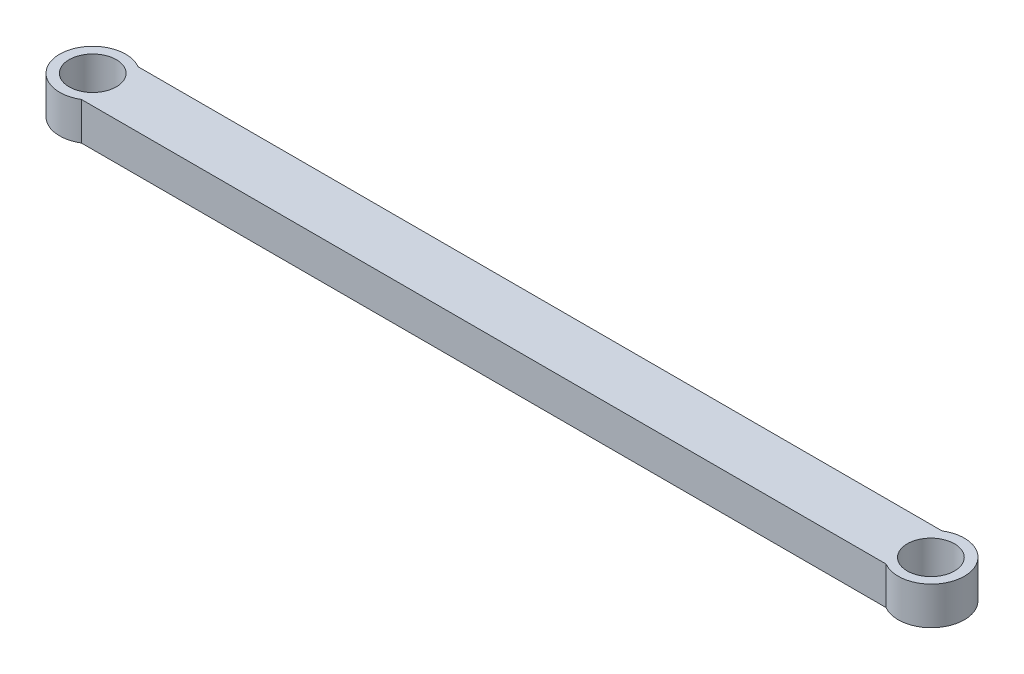
ISO-10303-21;
HEADER;
FILE_DESCRIPTION(('STEP AP214'),'2;1');
FILE_NAME('part.step','',(''),(''),'','','');
FILE_SCHEMA(('AUTOMOTIVE_DESIGN { 1 0 10303 214 1 1 1 1 }'));
ENDSEC;
DATA;
#1=APPLICATION_CONTEXT('core data for automotive mechanical design processes');
#2=APPLICATION_PROTOCOL_DEFINITION('international standard','automotive_design',2000,#1);
#3=PRODUCT_CONTEXT('',#1,'mechanical');
#4=PRODUCT('Part','Part','',(#3));
#5=PRODUCT_RELATED_PRODUCT_CATEGORY('part','',(#4));
#6=PRODUCT_DEFINITION_FORMATION('','',#4);
#7=PRODUCT_DEFINITION_CONTEXT('part definition',#1,'design');
#8=PRODUCT_DEFINITION('design','',#6,#7);
#9=PRODUCT_DEFINITION_SHAPE('','',#8);
#10=(LENGTH_UNIT() NAMED_UNIT(*) SI_UNIT(.MILLI.,.METRE.));
#11=(NAMED_UNIT(*) PLANE_ANGLE_UNIT() SI_UNIT($,.RADIAN.));
#12=(NAMED_UNIT(*) SI_UNIT($,.STERADIAN.) SOLID_ANGLE_UNIT());
#13=UNCERTAINTY_MEASURE_WITH_UNIT(LENGTH_MEASURE(1.E-05),#10,'distance_accuracy_value','');
#14=(GEOMETRIC_REPRESENTATION_CONTEXT(3) GLOBAL_UNCERTAINTY_ASSIGNED_CONTEXT((#13)) GLOBAL_UNIT_ASSIGNED_CONTEXT((#10,
#11,#12)) REPRESENTATION_CONTEXT('',''));
#15=CARTESIAN_POINT('',(0.,0.,0.));
#16=DIRECTION('',(0.,0.,1.));
#17=DIRECTION('',(1.,0.,0.));
#18=AXIS2_PLACEMENT_3D('',#15,#16,#17);
#19=CARTESIAN_POINT('',(0.,2.,1.5));
#20=DIRECTION('',(0.,0.,-1.));
#21=DIRECTION('',(-1.,0.,0.));
#22=AXIS2_PLACEMENT_3D('',#19,#20,#21);
#23=PLANE('',#22);
#24=DIRECTION('',(1.,0.,0.));
#25=VECTOR('',#24,1.);
#26=CARTESIAN_POINT('',(0.,0.,1.5));
#27=LINE('',#26,#25);
#28=CARTESIAN_POINT('',(0.901387818865998,0.,1.5));
#29=VERTEX_POINT('',#28);
#30=CARTESIAN_POINT('',(43.4998455410051,0.,1.5));
#31=VERTEX_POINT('',#30);
#32=EDGE_CURVE('E111',#29,#31,#27,.T.);
#33=ORIENTED_EDGE('',*,*,#32,.T.);
#34=DIRECTION('',(0.,-1.,0.));
#35=VECTOR('',#34,1.);
#36=CARTESIAN_POINT('',(43.4998455410051,2.,1.5));
#37=LINE('',#36,#35);
#38=CARTESIAN_POINT('',(43.4998455410051,2.,1.5));
#39=VERTEX_POINT('',#38);
#40=EDGE_CURVE('E11',#39,#31,#37,.T.);
#41=ORIENTED_EDGE('',*,*,#40,.F.);
#42=DIRECTION('',(1.,0.,0.));
#43=VECTOR('',#42,1.);
#44=CARTESIAN_POINT('',(0.,2.,1.5));
#45=LINE('',#44,#43);
#46=CARTESIAN_POINT('',(0.901387818865998,2.,1.5));
#47=VERTEX_POINT('',#46);
#48=EDGE_CURVE('E90',#47,#39,#45,.T.);
#49=ORIENTED_EDGE('',*,*,#48,.F.);
#50=DIRECTION('',(0.,-1.,0.));
#51=VECTOR('',#50,1.);
#52=CARTESIAN_POINT('',(0.901387818865998,2.,1.5));
#53=LINE('',#52,#51);
#54=EDGE_CURVE('E110',#47,#29,#53,.T.);
#55=ORIENTED_EDGE('',*,*,#54,.T.);
#56=EDGE_LOOP('',(#33,#41,#49,#55));
#57=FACE_BOUND('',#56,.T.);
#58=ADVANCED_FACE('F42',(#57),#23,.F.);
#59=CARTESIAN_POINT('',(44.3835054520691,2.,-0.0105115562545324));
#60=DIRECTION('',(0.,-1.,0.));
#61=DIRECTION('',(0.,0.,-1.));
#62=AXIS2_PLACEMENT_3D('',#59,#60,#61);
#63=CYLINDRICAL_SURFACE('',#62,1.75);
#64=CARTESIAN_POINT('',(44.3835054520691,0.,-0.0105115562545324));
#65=DIRECTION('',(0.,1.,0.));
#66=DIRECTION('',(0.,0.,1.));
#67=AXIS2_PLACEMENT_3D('',#64,#65,#66);
#68=CIRCLE('',#67,1.75);
#69=CARTESIAN_POINT('',(43.46485199404,0.,-1.5));
#70=VERTEX_POINT('',#69);
#71=EDGE_CURVE('E95',#31,#70,#68,.T.);
#72=ORIENTED_EDGE('',*,*,#71,.T.);
#73=DIRECTION('',(0.,-1.,0.));
#74=VECTOR('',#73,1.);
#75=CARTESIAN_POINT('',(43.46485199404,2.,-1.5));
#76=LINE('',#75,#74);
#77=CARTESIAN_POINT('',(43.46485199404,2.,-1.5));
#78=VERTEX_POINT('',#77);
#79=EDGE_CURVE('E50',#78,#70,#76,.T.);
#80=ORIENTED_EDGE('',*,*,#79,.F.);
#81=CARTESIAN_POINT('',(44.3835054520691,2.,-0.0105115562545324));
#82=DIRECTION('',(0.,1.,0.));
#83=DIRECTION('',(0.,0.,1.));
#84=AXIS2_PLACEMENT_3D('',#81,#82,#83);
#85=CIRCLE('',#84,1.75);
#86=EDGE_CURVE('E84',#39,#78,#85,.T.);
#87=ORIENTED_EDGE('',*,*,#86,.F.);
#88=ORIENTED_EDGE('',*,*,#40,.T.);
#89=EDGE_LOOP('',(#72,#80,#87,#88));
#90=FACE_BOUND('',#89,.T.);
#91=ADVANCED_FACE('F94',(#90),#63,.T.);
#92=CARTESIAN_POINT('',(0.,2.,-1.5));
#93=DIRECTION('',(0.,0.,-1.));
#94=DIRECTION('',(-1.,0.,0.));
#95=AXIS2_PLACEMENT_3D('',#92,#93,#94);
#96=PLANE('',#95);
#97=DIRECTION('',(1.,0.,0.));
#98=VECTOR('',#97,1.);
#99=CARTESIAN_POINT('',(0.,0.,-1.5));
#100=LINE('',#99,#98);
#101=CARTESIAN_POINT('',(0.901387818865998,0.,-1.5));
#102=VERTEX_POINT('',#101);
#103=EDGE_CURVE('E115',#102,#70,#100,.T.);
#104=ORIENTED_EDGE('',*,*,#103,.F.);
#105=DIRECTION('',(0.,-1.,0.));
#106=VECTOR('',#105,1.);
#107=CARTESIAN_POINT('',(0.901387818865998,2.,-1.5));
#108=LINE('',#107,#106);
#109=CARTESIAN_POINT('',(0.901387818865998,2.,-1.5));
#110=VERTEX_POINT('',#109);
#111=EDGE_CURVE('E74',#110,#102,#108,.T.);
#112=ORIENTED_EDGE('',*,*,#111,.F.);
#113=DIRECTION('',(1.,0.,0.));
#114=VECTOR('',#113,1.);
#115=CARTESIAN_POINT('',(0.,2.,-1.5));
#116=LINE('',#115,#114);
#117=EDGE_CURVE('E88',#110,#78,#116,.T.);
#118=ORIENTED_EDGE('',*,*,#117,.T.);
#119=ORIENTED_EDGE('',*,*,#79,.T.);
#120=EDGE_LOOP('',(#104,#112,#118,#119));
#121=FACE_BOUND('',#120,.T.);
#122=ADVANCED_FACE('F99',(#121),#96,.T.);
#123=CARTESIAN_POINT('',(44.3835054520691,2.,0.0105115562545301));
#124=DIRECTION('',(0.,-1.,0.));
#125=DIRECTION('',(0.,0.,-1.));
#126=AXIS2_PLACEMENT_3D('',#123,#124,#125);
#127=CYLINDRICAL_SURFACE('',#126,1.25);
#128=CARTESIAN_POINT('',(44.3835054520691,2.,0.0105115562545301));
#129=DIRECTION('',(0.,1.,0.));
#130=DIRECTION('',(0.,0.,1.));
#131=AXIS2_PLACEMENT_3D('',#128,#129,#130);
#132=CIRCLE('',#131,1.25);
#133=CARTESIAN_POINT('',(44.3835054520691,2.,1.26051155625453));
#134=VERTEX_POINT('',#133);
#135=EDGE_CURVE('E101',#134,#134,#132,.T.);
#136=ORIENTED_EDGE('',*,*,#135,.T.);
#137=EDGE_LOOP('',(#136));
#138=FACE_BOUND('',#137,.T.);
#139=CARTESIAN_POINT('',(44.3835054520691,0.,0.0105115562545301));
#140=DIRECTION('',(0.,1.,0.));
#141=DIRECTION('',(0.,0.,1.));
#142=AXIS2_PLACEMENT_3D('',#139,#140,#141);
#143=CIRCLE('',#142,1.25);
#144=CARTESIAN_POINT('',(44.3835054520691,0.,1.26051155625453));
#145=VERTEX_POINT('',#144);
#146=EDGE_CURVE('E118',#145,#145,#143,.T.);
#147=ORIENTED_EDGE('',*,*,#146,.F.);
#148=EDGE_LOOP('',(#147));
#149=FACE_BOUND('',#148,.T.);
#150=ADVANCED_FACE('F146',(#138,#149),#127,.F.);
#151=CARTESIAN_POINT('',(0.,2.,0.));
#152=DIRECTION('',(0.,-1.,0.));
#153=DIRECTION('',(0.,0.,-1.));
#154=AXIS2_PLACEMENT_3D('',#151,#152,#153);
#155=CYLINDRICAL_SURFACE('',#154,1.75);
#156=CARTESIAN_POINT('',(0.,0.,0.));
#157=DIRECTION('',(0.,1.,0.));
#158=DIRECTION('',(0.,0.,1.));
#159=AXIS2_PLACEMENT_3D('',#156,#157,#158);
#160=CIRCLE('',#159,1.75);
#161=EDGE_CURVE('E77',#102,#29,#160,.T.);
#162=ORIENTED_EDGE('',*,*,#161,.T.);
#163=ORIENTED_EDGE('',*,*,#54,.F.);
#164=CARTESIAN_POINT('',(0.,2.,0.));
#165=DIRECTION('',(0.,1.,0.));
#166=DIRECTION('',(0.,0.,1.));
#167=AXIS2_PLACEMENT_3D('',#164,#165,#166);
#168=CIRCLE('',#167,1.75);
#169=EDGE_CURVE('E58',#110,#47,#168,.T.);
#170=ORIENTED_EDGE('',*,*,#169,.F.);
#171=ORIENTED_EDGE('',*,*,#111,.T.);
#172=EDGE_LOOP('',(#162,#163,#170,#171));
#173=FACE_BOUND('',#172,.T.);
#174=ADVANCED_FACE('F138',(#173),#155,.T.);
#175=CARTESIAN_POINT('',(0.,2.,0.));
#176=DIRECTION('',(0.,-1.,0.));
#177=DIRECTION('',(0.,0.,-1.));
#178=AXIS2_PLACEMENT_3D('',#175,#176,#177);
#179=CYLINDRICAL_SURFACE('',#178,1.25);
#180=CARTESIAN_POINT('',(0.,2.,0.));
#181=DIRECTION('',(0.,1.,0.));
#182=DIRECTION('',(0.,0.,1.));
#183=AXIS2_PLACEMENT_3D('',#180,#181,#182);
#184=CIRCLE('',#183,1.25);
#185=CARTESIAN_POINT('',(0.,2.,1.25));
#186=VERTEX_POINT('',#185);
#187=EDGE_CURVE('E107',#186,#186,#184,.T.);
#188=ORIENTED_EDGE('',*,*,#187,.T.);
#189=EDGE_LOOP('',(#188));
#190=FACE_BOUND('',#189,.T.);
#191=CARTESIAN_POINT('',(0.,0.,0.));
#192=DIRECTION('',(0.,1.,0.));
#193=DIRECTION('',(0.,0.,1.));
#194=AXIS2_PLACEMENT_3D('',#191,#192,#193);
#195=CIRCLE('',#194,1.25);
#196=CARTESIAN_POINT('',(0.,0.,1.25));
#197=VERTEX_POINT('',#196);
#198=EDGE_CURVE('E121',#197,#197,#195,.T.);
#199=ORIENTED_EDGE('',*,*,#198,.F.);
#200=EDGE_LOOP('',(#199));
#201=FACE_BOUND('',#200,.T.);
#202=ADVANCED_FACE('F136',(#190,#201),#179,.F.);
#203=CARTESIAN_POINT('',(0.,2.,0.));
#204=DIRECTION('',(0.,1.,0.));
#205=DIRECTION('',(0.,0.,1.));
#206=AXIS2_PLACEMENT_3D('',#203,#204,#205);
#207=PLANE('',#206);
#208=ORIENTED_EDGE('',*,*,#48,.T.);
#209=ORIENTED_EDGE('',*,*,#86,.T.);
#210=ORIENTED_EDGE('',*,*,#117,.F.);
#211=ORIENTED_EDGE('',*,*,#169,.T.);
#212=EDGE_LOOP('',(#208,#209,#210,#211));
#213=FACE_BOUND('',#212,.T.);
#214=ORIENTED_EDGE('',*,*,#135,.F.);
#215=EDGE_LOOP('',(#214));
#216=FACE_BOUND('',#215,.T.);
#217=ORIENTED_EDGE('',*,*,#187,.F.);
#218=EDGE_LOOP('',(#217));
#219=FACE_BOUND('',#218,.T.);
#220=ADVANCED_FACE('F85',(#213,#216,#219),#207,.T.);
#221=CARTESIAN_POINT('',(0.,0.,0.));
#222=DIRECTION('',(0.,1.,0.));
#223=DIRECTION('',(0.,0.,1.));
#224=AXIS2_PLACEMENT_3D('',#221,#222,#223);
#225=PLANE('',#224);
#226=ORIENTED_EDGE('',*,*,#32,.F.);
#227=ORIENTED_EDGE('',*,*,#161,.F.);
#228=ORIENTED_EDGE('',*,*,#103,.T.);
#229=ORIENTED_EDGE('',*,*,#71,.F.);
#230=EDGE_LOOP('',(#226,#227,#228,#229));
#231=FACE_BOUND('',#230,.T.);
#232=ORIENTED_EDGE('',*,*,#146,.T.);
#233=EDGE_LOOP('',(#232));
#234=FACE_BOUND('',#233,.T.);
#235=ORIENTED_EDGE('',*,*,#198,.T.);
#236=EDGE_LOOP('',(#235));
#237=FACE_BOUND('',#236,.T.);
#238=ADVANCED_FACE('F128',(#231,#234,#237),#225,.F.);
#239=CLOSED_SHELL('',(#58,#91,#122,#150,#174,#202,#220,#238));
#240=MANIFOLD_SOLID_BREP('B2',#239);
#241=ADVANCED_BREP_SHAPE_REPRESENTATION('',(#18,#240),#14);
#242=SHAPE_DEFINITION_REPRESENTATION(#9,#241);
ENDSEC;
END-ISO-10303-21;
